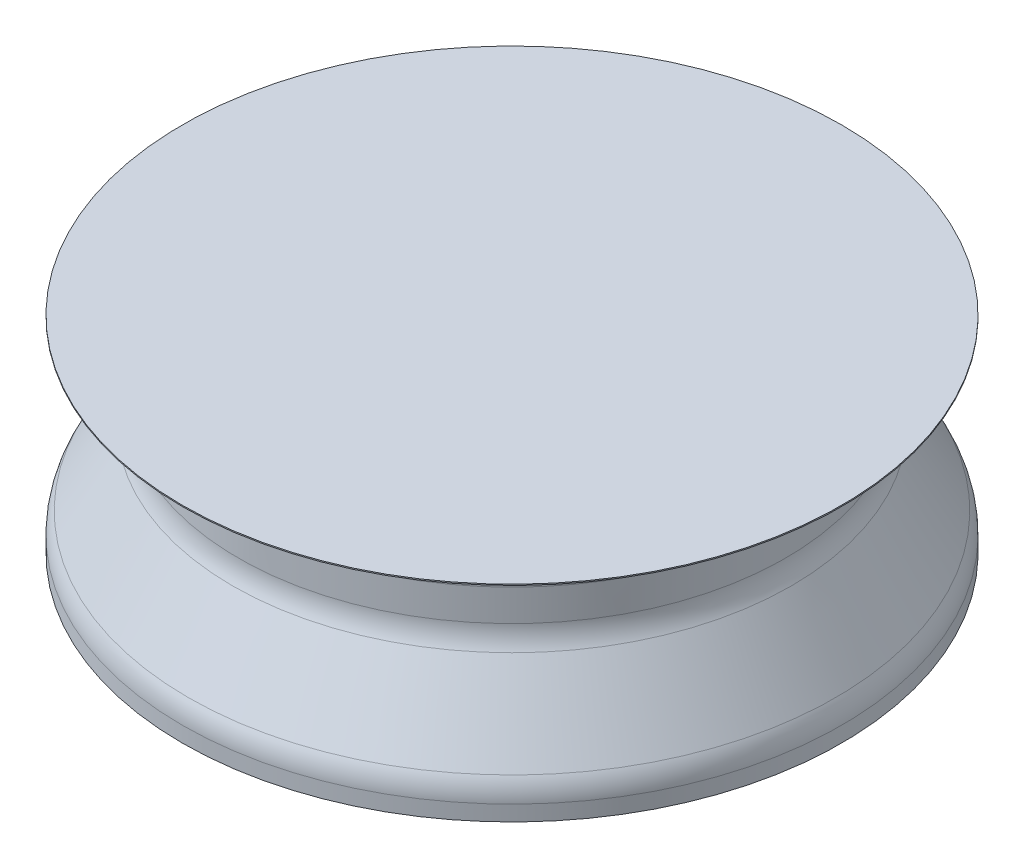
ISO-10303-21;
HEADER;
FILE_DESCRIPTION(('STEP AP214'),'2;1');
FILE_NAME('part.step','',(''),(''),'','','');
FILE_SCHEMA(('AUTOMOTIVE_DESIGN { 1 0 10303 214 1 1 1 1 }'));
ENDSEC;
DATA;
#1=APPLICATION_CONTEXT('core data for automotive mechanical design processes');
#2=APPLICATION_PROTOCOL_DEFINITION('international standard','automotive_design',2000,#1);
#3=PRODUCT_CONTEXT('',#1,'mechanical');
#4=PRODUCT('Part','Part','',(#3));
#5=PRODUCT_RELATED_PRODUCT_CATEGORY('part','',(#4));
#6=PRODUCT_DEFINITION_FORMATION('','',#4);
#7=PRODUCT_DEFINITION_CONTEXT('part definition',#1,'design');
#8=PRODUCT_DEFINITION('design','',#6,#7);
#9=PRODUCT_DEFINITION_SHAPE('','',#8);
#10=(LENGTH_UNIT() NAMED_UNIT(*) SI_UNIT(.MILLI.,.METRE.));
#11=(NAMED_UNIT(*) PLANE_ANGLE_UNIT() SI_UNIT($,.RADIAN.));
#12=(NAMED_UNIT(*) SI_UNIT($,.STERADIAN.) SOLID_ANGLE_UNIT());
#13=UNCERTAINTY_MEASURE_WITH_UNIT(LENGTH_MEASURE(1.E-05),#10,'distance_accuracy_value','');
#14=(GEOMETRIC_REPRESENTATION_CONTEXT(3) GLOBAL_UNCERTAINTY_ASSIGNED_CONTEXT((#13)) GLOBAL_UNIT_ASSIGNED_CONTEXT((#10,
#11,#12)) REPRESENTATION_CONTEXT('',''));
#15=CARTESIAN_POINT('',(0.,0.,0.));
#16=DIRECTION('',(0.,0.,1.));
#17=DIRECTION('',(1.,0.,0.));
#18=AXIS2_PLACEMENT_3D('',#15,#16,#17);
#19=CARTESIAN_POINT('',(80.,50.,0.));
#20=DIRECTION('',(0.,-1.,0.));
#21=DIRECTION('',(0.,0.,-1.));
#22=AXIS2_PLACEMENT_3D('',#19,#20,#21);
#23=CYLINDRICAL_SURFACE('',#22,80.);
#24=CARTESIAN_POINT('',(80.,3.75288739785842,0.));
#25=DIRECTION('',(0.,1.,0.));
#26=DIRECTION('',(0.,0.,1.));
#27=AXIS2_PLACEMENT_3D('',#24,#25,#26);
#28=CIRCLE('',#27,80.);
#29=CARTESIAN_POINT('',(80.,3.75288739785842,80.));
#30=VERTEX_POINT('',#29);
#31=EDGE_CURVE('E50',#30,#30,#28,.F.);
#32=ORIENTED_EDGE('',*,*,#31,.T.);
#33=EDGE_LOOP('',(#32));
#34=FACE_BOUND('',#33,.T.);
#35=CARTESIAN_POINT('',(80.,0.,0.));
#36=DIRECTION('',(0.,1.,0.));
#37=DIRECTION('',(0.,0.,1.));
#38=AXIS2_PLACEMENT_3D('',#35,#36,#37);
#39=CIRCLE('',#38,80.);
#40=CARTESIAN_POINT('',(80.,0.,80.));
#41=VERTEX_POINT('',#40);
#42=EDGE_CURVE('E66',#41,#41,#39,.T.);
#43=ORIENTED_EDGE('',*,*,#42,.T.);
#44=EDGE_LOOP('',(#43));
#45=FACE_BOUND('',#44,.T.);
#46=ADVANCED_FACE('F35',(#34,#45),#23,.T.);
#47=CARTESIAN_POINT('',(80.,0.,0.));
#48=DIRECTION('',(0.,1.,0.));
#49=DIRECTION('',(0.,0.,1.));
#50=AXIS2_PLACEMENT_3D('',#47,#48,#49);
#51=PLANE('',#50);
#52=CARTESIAN_POINT('',(80.,0.,0.));
#53=DIRECTION('',(0.,-1.,0.));
#54=DIRECTION('',(0.,0.,-1.));
#55=AXIS2_PLACEMENT_3D('',#52,#53,#54);
#56=CIRCLE('',#55,25.);
#57=CARTESIAN_POINT('',(80.,0.,-25.));
#58=VERTEX_POINT('',#57);
#59=EDGE_CURVE('E65',#58,#58,#56,.T.);
#60=ORIENTED_EDGE('',*,*,#59,.F.);
#61=EDGE_LOOP('',(#60));
#62=FACE_BOUND('',#61,.T.);
#63=ORIENTED_EDGE('',*,*,#42,.F.);
#64=EDGE_LOOP('',(#63));
#65=FACE_BOUND('',#64,.T.);
#66=ADVANCED_FACE('F82',(#62,#65),#51,.F.);
#67=CARTESIAN_POINT('',(80.,30.,0.));
#68=DIRECTION('',(0.,-1.,0.));
#69=DIRECTION('',(0.,0.,-1.));
#70=AXIS2_PLACEMENT_3D('',#67,#68,#69);
#71=CYLINDRICAL_SURFACE('',#70,25.);
#72=CARTESIAN_POINT('',(80.,30.,0.));
#73=DIRECTION('',(0.,-1.,0.));
#74=DIRECTION('',(0.,0.,-1.));
#75=AXIS2_PLACEMENT_3D('',#72,#73,#74);
#76=CIRCLE('',#75,25.);
#77=CARTESIAN_POINT('',(80.,30.,-25.));
#78=VERTEX_POINT('',#77);
#79=EDGE_CURVE('E69',#78,#78,#76,.T.);
#80=ORIENTED_EDGE('',*,*,#79,.F.);
#81=EDGE_LOOP('',(#80));
#82=FACE_BOUND('',#81,.T.);
#83=ORIENTED_EDGE('',*,*,#59,.T.);
#84=EDGE_LOOP('',(#83));
#85=FACE_BOUND('',#84,.T.);
#86=ADVANCED_FACE('F79',(#82,#85),#71,.F.);
#87=CARTESIAN_POINT('',(80.,30.,0.));
#88=DIRECTION('',(0.,-1.,0.));
#89=DIRECTION('',(0.,0.,-1.));
#90=AXIS2_PLACEMENT_3D('',#87,#88,#89);
#91=PLANE('',#90);
#92=ORIENTED_EDGE('',*,*,#79,.T.);
#93=EDGE_LOOP('',(#92));
#94=FACE_BOUND('',#93,.T.);
#95=ADVANCED_FACE('F77',(#94),#91,.T.);
#96=CARTESIAN_POINT('',(0.,49.7239558559297,0.));
#97=DIRECTION('',(0.,1.,0.));
#98=DIRECTION('',(0.,0.,1.));
#99=AXIS2_PLACEMENT_3D('',#96,#97,#98);
#100=PLANE('',#99);
#101=CARTESIAN_POINT('',(80.,49.7239558559297,0.));
#102=DIRECTION('',(0.,1.,0.));
#103=DIRECTION('',(0.,0.,1.));
#104=AXIS2_PLACEMENT_3D('',#101,#102,#103);
#105=CIRCLE('',#104,76.3814339426941);
#106=CARTESIAN_POINT('',(80.,49.7239558559297,76.3814339426941));
#107=VERTEX_POINT('',#106);
#108=EDGE_CURVE('E55',#107,#107,#105,.T.);
#109=ORIENTED_EDGE('',*,*,#108,.T.);
#110=EDGE_LOOP('',(#109));
#111=FACE_BOUND('',#110,.T.);
#112=CARTESIAN_POINT('',(80.,49.7239558559297,0.));
#113=DIRECTION('',(0.,1.,0.));
#114=DIRECTION('',(0.,0.,1.));
#115=AXIS2_PLACEMENT_3D('',#112,#113,#114);
#116=CIRCLE('',#115,80.);
#117=CARTESIAN_POINT('',(80.,49.7239558559297,80.));
#118=VERTEX_POINT('',#117);
#119=EDGE_CURVE('E62',#118,#118,#116,.T.);
#120=ORIENTED_EDGE('',*,*,#119,.F.);
#121=EDGE_LOOP('',(#120));
#122=FACE_BOUND('',#121,.T.);
#123=ADVANCED_FACE('F115',(#111,#122),#100,.F.);
#124=CARTESIAN_POINT('',(80.,6.51149201851559,0.));
#125=DIRECTION('',(0.,-1.,0.));
#126=DIRECTION('',(0.,0.,-1.));
#127=AXIS2_PLACEMENT_3D('',#124,#125,#126);
#128=CONICAL_SURFACE('',#127,80.,0.538331999044788);
#129=CARTESIAN_POINT('',(80.,26.9484332568617,0.));
#130=DIRECTION('',(0.,1.,0.));
#131=DIRECTION('',(0.,0.,1.));
#132=AXIS2_PLACEMENT_3D('',#129,#130,#131);
#133=CIRCLE('',#132,67.79578327148);
#134=CARTESIAN_POINT('',(80.,26.9484332568617,67.79578327148));
#135=VERTEX_POINT('',#134);
#136=EDGE_CURVE('E42',#135,#135,#133,.F.);
#137=ORIENTED_EDGE('',*,*,#136,.T.);
#138=EDGE_LOOP('',(#137));
#139=FACE_BOUND('',#138,.T.);
#140=CARTESIAN_POINT('',(80.,8.87993357981148,0.));
#141=DIRECTION('',(0.,-1.,0.));
#142=DIRECTION('',(0.,0.,-1.));
#143=AXIS2_PLACEMENT_3D('',#140,#141,#142);
#144=CIRCLE('',#143,78.5856506712142);
#145=CARTESIAN_POINT('',(80.,8.87993357981148,-78.5856506712142));
#146=VERTEX_POINT('',#145);
#147=EDGE_CURVE('E46',#146,#146,#144,.F.);
#148=ORIENTED_EDGE('',*,*,#147,.T.);
#149=EDGE_LOOP('',(#148));
#150=FACE_BOUND('',#149,.T.);
#151=ADVANCED_FACE('F117',(#139,#150),#128,.T.);
#152=CARTESIAN_POINT('',(80.,0.,0.));
#153=DIRECTION('',(0.,-1.,0.));
#154=DIRECTION('',(0.,0.,-1.));
#155=AXIS2_PLACEMENT_3D('',#152,#153,#154);
#156=CYLINDRICAL_SURFACE('',#155,66.3814339426941);
#157=CARTESIAN_POINT('',(80.,32.0754794388147,0.));
#158=DIRECTION('',(0.,-1.,0.));
#159=DIRECTION('',(0.,0.,-1.));
#160=AXIS2_PLACEMENT_3D('',#157,#158,#159);
#161=CIRCLE('',#160,66.3814339426941);
#162=CARTESIAN_POINT('',(80.,32.0754794388147,-66.3814339426941));
#163=VERTEX_POINT('',#162);
#164=EDGE_CURVE('E10',#163,#163,#161,.F.);
#165=ORIENTED_EDGE('',*,*,#164,.T.);
#166=EDGE_LOOP('',(#165));
#167=FACE_BOUND('',#166,.T.);
#168=CARTESIAN_POINT('',(80.,39.7239558559297,0.));
#169=DIRECTION('',(0.,1.,0.));
#170=DIRECTION('',(0.,0.,1.));
#171=AXIS2_PLACEMENT_3D('',#168,#169,#170);
#172=CIRCLE('',#171,66.3814339426941);
#173=CARTESIAN_POINT('',(80.,39.7239558559297,66.3814339426941));
#174=VERTEX_POINT('',#173);
#175=EDGE_CURVE('E58',#174,#174,#172,.F.);
#176=ORIENTED_EDGE('',*,*,#175,.T.);
#177=EDGE_LOOP('',(#176));
#178=FACE_BOUND('',#177,.T.);
#179=ADVANCED_FACE('F108',(#167,#178),#156,.T.);
#180=CARTESIAN_POINT('',(80.,50.,0.));
#181=DIRECTION('',(0.,1.,0.));
#182=DIRECTION('',(0.,0.,1.));
#183=AXIS2_PLACEMENT_3D('',#180,#181,#182);
#184=PLANE('',#183);
#185=CARTESIAN_POINT('',(80.,50.,0.));
#186=DIRECTION('',(0.,1.,0.));
#187=DIRECTION('',(0.,0.,1.));
#188=AXIS2_PLACEMENT_3D('',#185,#186,#187);
#189=CIRCLE('',#188,80.);
#190=CARTESIAN_POINT('',(80.,50.,80.));
#191=VERTEX_POINT('',#190);
#192=EDGE_CURVE('E61',#191,#191,#189,.T.);
#193=ORIENTED_EDGE('',*,*,#192,.T.);
#194=EDGE_LOOP('',(#193));
#195=FACE_BOUND('',#194,.T.);
#196=ADVANCED_FACE('F100',(#195),#184,.T.);
#197=ORIENTED_EDGE('',*,*,#119,.T.);
#198=EDGE_LOOP('',(#197));
#199=FACE_BOUND('',#198,.T.);
#200=ORIENTED_EDGE('',*,*,#192,.F.);
#201=EDGE_LOOP('',(#200));
#202=FACE_BOUND('',#201,.T.);
#203=ADVANCED_FACE('F94',(#199,#202),#23,.T.);
#204=CARTESIAN_POINT('',(80.,39.7239558559297,0.));
#205=DIRECTION('',(0.,1.,0.));
#206=DIRECTION('',(0.,0.,1.));
#207=AXIS2_PLACEMENT_3D('',#204,#205,#206);
#208=TOROIDAL_SURFACE('',#207,76.3814339426941,10.);
#209=ORIENTED_EDGE('',*,*,#108,.F.);
#210=EDGE_LOOP('',(#209));
#211=FACE_BOUND('',#210,.T.);
#212=ORIENTED_EDGE('',*,*,#175,.F.);
#213=EDGE_LOOP('',(#212));
#214=FACE_BOUND('',#213,.T.);
#215=ADVANCED_FACE('F99',(#211,#214),#208,.F.);
#216=CARTESIAN_POINT('',(80.,3.75288739785842,0.));
#217=DIRECTION('',(0.,1.,0.));
#218=DIRECTION('',(0.,0.,1.));
#219=AXIS2_PLACEMENT_3D('',#216,#217,#218);
#220=TOROIDAL_SURFACE('',#219,70.,10.);
#221=ORIENTED_EDGE('',*,*,#147,.F.);
#222=EDGE_LOOP('',(#221));
#223=FACE_BOUND('',#222,.T.);
#224=ORIENTED_EDGE('',*,*,#31,.F.);
#225=EDGE_LOOP('',(#224));
#226=FACE_BOUND('',#225,.T.);
#227=ADVANCED_FACE('F106',(#223,#226),#220,.T.);
#228=CARTESIAN_POINT('',(80.,32.0754794388147,0.));
#229=DIRECTION('',(0.,-1.,0.));
#230=DIRECTION('',(0.,0.,-1.));
#231=AXIS2_PLACEMENT_3D('',#228,#229,#230);
#232=TOROIDAL_SURFACE('',#231,76.3814339426941,10.);
#233=ORIENTED_EDGE('',*,*,#164,.F.);
#234=EDGE_LOOP('',(#233));
#235=FACE_BOUND('',#234,.T.);
#236=ORIENTED_EDGE('',*,*,#136,.F.);
#237=EDGE_LOOP('',(#236));
#238=FACE_BOUND('',#237,.T.);
#239=ADVANCED_FACE('F37',(#235,#238),#232,.F.);
#240=CLOSED_SHELL('',(#46,#66,#86,#95,#123,#151,#179,#196,#203,#215,#227,#239));
#241=MANIFOLD_SOLID_BREP('B2',#240);
#242=ADVANCED_BREP_SHAPE_REPRESENTATION('',(#18,#241),#14);
#243=SHAPE_DEFINITION_REPRESENTATION(#9,#242);
ENDSEC;
END-ISO-10303-21;
